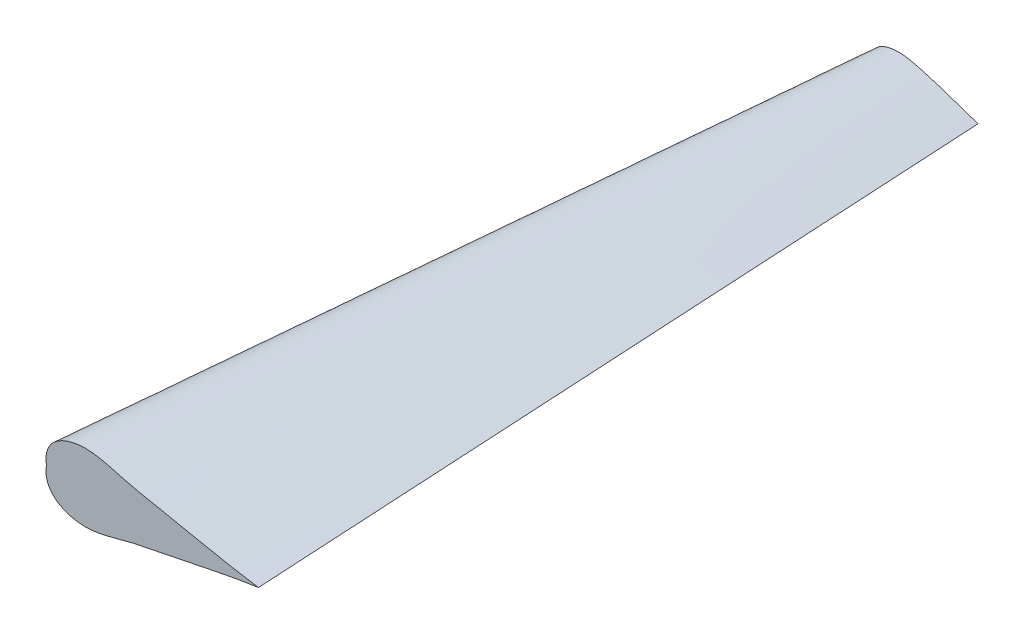
ISO-10303-21;
HEADER;
FILE_DESCRIPTION(('STEP AP214'),'2;1');
FILE_NAME('part.step','',(''),(''),'','','');
FILE_SCHEMA(('AUTOMOTIVE_DESIGN { 1 0 10303 214 1 1 1 1 }'));
ENDSEC;
DATA;
#1=APPLICATION_CONTEXT('core data for automotive mechanical design processes');
#2=APPLICATION_PROTOCOL_DEFINITION('international standard','automotive_design',2000,#1);
#3=PRODUCT_CONTEXT('',#1,'mechanical');
#4=PRODUCT('Part','Part','',(#3));
#5=PRODUCT_RELATED_PRODUCT_CATEGORY('part','',(#4));
#6=PRODUCT_DEFINITION_FORMATION('','',#4);
#7=PRODUCT_DEFINITION_CONTEXT('part definition',#1,'design');
#8=PRODUCT_DEFINITION('design','',#6,#7);
#9=PRODUCT_DEFINITION_SHAPE('','',#8);
#10=(LENGTH_UNIT() NAMED_UNIT(*) SI_UNIT(.MILLI.,.METRE.));
#11=(NAMED_UNIT(*) PLANE_ANGLE_UNIT() SI_UNIT($,.RADIAN.));
#12=(NAMED_UNIT(*) SI_UNIT($,.STERADIAN.) SOLID_ANGLE_UNIT());
#13=UNCERTAINTY_MEASURE_WITH_UNIT(LENGTH_MEASURE(1.E-05),#10,'distance_accuracy_value','');
#14=(GEOMETRIC_REPRESENTATION_CONTEXT(3) GLOBAL_UNCERTAINTY_ASSIGNED_CONTEXT((#13)) GLOBAL_UNIT_ASSIGNED_CONTEXT((#10,
#11,#12)) REPRESENTATION_CONTEXT('',''));
#15=CARTESIAN_POINT('',(0.,0.,0.));
#16=DIRECTION('',(0.,0.,1.));
#17=DIRECTION('',(1.,0.,0.));
#18=AXIS2_PLACEMENT_3D('',#15,#16,#17);
#19=CARTESIAN_POINT('',(137.136776449172,-31.2486545565491,1000.));
#20=DIRECTION('',(0.,0.,-1.));
#21=DIRECTION('',(-1.,0.,0.));
#22=AXIS2_PLACEMENT_3D('',#19,#20,#21);
#23=PLANE('',#22);
#24=CARTESIAN_POINT('',(0.,0.,1000.));
#25=CARTESIAN_POINT('',(-5.37469118703305,-30.8983506499028,1000.));
#26=CARTESIAN_POINT('',(46.7334176974178,-58.7828282851548,1000.));
#27=CARTESIAN_POINT('',(105.349466996373,-37.1004353119499,1000.));
#28=CARTESIAN_POINT('',(189.501798099044,-21.4886832675327,1000.));
#29=CARTESIAN_POINT('',(251.048679669683,-7.10279139100405,1000.));
#30=CARTESIAN_POINT('',(300.,0.,1000.));
#31=B_SPLINE_CURVE_WITH_KNOTS('',3,(#24,#25,#26,#27,#28,#29,#30),.UNSPECIFIED.,.F.,.F.,(4,1,1,1,
4),(0.,0.224641108120641,0.429840548832411,0.552694137417254,1.),.UNSPECIFIED.);
#32=CARTESIAN_POINT('',(0.,0.,1000.));
#33=VERTEX_POINT('',#32);
#34=CARTESIAN_POINT('',(300.,0.,1000.));
#35=VERTEX_POINT('',#34);
#36=EDGE_CURVE('E84',#33,#35,#31,.T.);
#37=ORIENTED_EDGE('',*,*,#36,.T.);
#38=CARTESIAN_POINT('',(300.,0.,1000.));
#39=CARTESIAN_POINT('',(251.048679669683,7.10279139100405,1000.));
#40=CARTESIAN_POINT('',(189.501798099044,21.4886832675327,1000.));
#41=CARTESIAN_POINT('',(105.349466996373,37.1004353119499,1000.));
#42=CARTESIAN_POINT('',(46.7334176974178,58.7828282851548,1000.));
#43=CARTESIAN_POINT('',(-5.37469118703305,30.8983506499028,1000.));
#44=CARTESIAN_POINT('',(0.,0.,1000.));
#45=B_SPLINE_CURVE_WITH_KNOTS('',3,(#38,#39,#40,#41,#42,#43,#44),.UNSPECIFIED.,.F.,.F.,(4,1,1,1,
4),(0.,0.447305862582746,0.570159451167589,0.775358891879359,1.),.UNSPECIFIED.);
#46=EDGE_CURVE('E14',#35,#33,#45,.T.);
#47=ORIENTED_EDGE('',*,*,#46,.T.);
#48=EDGE_LOOP('',(#37,#47));
#49=FACE_BOUND('',#48,.T.);
#50=ADVANCED_FACE('F71',(#49),#23,.F.);
#51=CARTESIAN_POINT('',(236.194120911862,50.6941308539003,0.));
#52=DIRECTION('',(0.,0.,-1.));
#53=DIRECTION('',(-1.,0.,0.));
#54=AXIS2_PLACEMENT_3D('',#51,#52,#53);
#55=PLANE('',#54);
#56=CARTESIAN_POINT('',(168.18857931216,77.3843621567377,0.));
#57=CARTESIAN_POINT('',(164.65724359174,55.3009599443541,0.));
#58=CARTESIAN_POINT('',(197.150828079061,41.1034128919331,0.));
#59=CARTESIAN_POINT('',(252.932096047086,54.2409456326803,0.));
#60=CARTESIAN_POINT('',(291.050772216917,68.0305693868342,0.));
#61=CARTESIAN_POINT('',(318.18857931216,77.3843621567377,0.));
#62=B_SPLINE_CURVE_WITH_KNOTS('',3,(#56,#57,#58,#59,#60,#61),.UNSPECIFIED.,.F.,.F.,(4,1,1,4),
(0.,0.300097882384008,0.498607647608849,1.),.UNSPECIFIED.);
#63=CARTESIAN_POINT('',(168.18857931216,77.3843621567377,0.));
#64=VERTEX_POINT('',#63);
#65=CARTESIAN_POINT('',(318.18857931216,77.3843621567377,0.));
#66=VERTEX_POINT('',#65);
#67=EDGE_CURVE('E106',#64,#66,#62,.T.);
#68=ORIENTED_EDGE('',*,*,#67,.F.);
#69=CARTESIAN_POINT('',(318.18857931216,77.3843621567377,0.));
#70=CARTESIAN_POINT('',(291.050772216917,86.7381549266412,0.));
#71=CARTESIAN_POINT('',(252.932096047087,100.527778680795,0.));
#72=CARTESIAN_POINT('',(197.150828079061,113.665311421542,0.));
#73=CARTESIAN_POINT('',(164.65724359174,99.4677643691214,0.));
#74=CARTESIAN_POINT('',(168.18857931216,77.3843621567377,0.));
#75=B_SPLINE_CURVE_WITH_KNOTS('',3,(#69,#70,#71,#72,#73,#74),.UNSPECIFIED.,.F.,.F.,(4,1,1,4),
(0.,0.501392352391151,0.699902117615992,1.),.UNSPECIFIED.);
#76=EDGE_CURVE('E115',#66,#64,#75,.T.);
#77=ORIENTED_EDGE('',*,*,#76,.F.);
#78=EDGE_LOOP('',(#68,#77));
#79=FACE_BOUND('',#78,.T.);
#80=ADVANCED_FACE('F123',(#79),#55,.T.);
#81=CARTESIAN_POINT('',(168.18857931216,77.3843621567377,0.));
#82=CARTESIAN_POINT('',(0.,0.,1000.));
#83=CARTESIAN_POINT('',(165.545164560016,60.8536225705259,0.));
#84=CARTESIAN_POINT('',(-5.37469118703305,-30.8983506499028,1000.));
#85=CARTESIAN_POINT('',(179.29680008681,48.9044421256928,0.));
#86=CARTESIAN_POINT('',(31.0051551856178,-50.3662038165103,1000.));
#87=CARTESIAN_POINT('',(205.490976055416,44.7235186845403,0.));
#88=CARTESIAN_POINT('',(78.5603380091365,-47.0098786991808,1000.));
#89=CARTESIAN_POINT('',(221.127878917005,46.7504571755196,0.));
#90=CARTESIAN_POINT('',(107.772065756632,-37.4653952798988,1000.));
#91=CARTESIAN_POINT('',(235.156284959351,50.3763363117218,0.));
#92=CARTESIAN_POINT('',(135.083985015742,-31.5841541062364,1000.));
#93=CARTESIAN_POINT('',(266.689212370897,59.2176519905368,0.));
#94=CARTESIAN_POINT('',(196.924985552453,-19.7535966253056,1000.));
#95=CARTESIAN_POINT('',(293.978197655058,69.0395872047299,0.));
#96=CARTESIAN_POINT('',(251.048679669683,-7.10279139100405,1000.));
#97=CARTESIAN_POINT('',(318.18857931216,77.3843621567377,0.));
#98=CARTESIAN_POINT('',(300.,0.,1000.));
#99=B_SPLINE_SURFACE_WITH_KNOTS('',3,1,((#81,#82),(#83,#84),(#85,#86),(#87,#88),(#89,#90),(#91,
#92),(#93,#94),(#95,#96),(#97,#98)),.UNSPECIFIED.,.F.,.F.,.F.,(4,1,1,1,1,1,4),(2,2),(0.,
0.224641108120641,0.300097882384008,0.429840548832411,0.498607647608849,0.552694137417254,1.),
(0.,1.),.UNSPECIFIED.);
#100=DIRECTION('',(-0.0181313819424192,-0.0771410126406209,0.996855314053969));
#101=VECTOR('',#100,1.);
#102=CARTESIAN_POINT('',(309.09428965608,38.6921810783689,500.));
#103=LINE('',#102,#101);
#104=EDGE_CURVE('E95',#66,#35,#103,.T.);
#105=DIRECTION('',(0.165378227758755,0.0760913060926108,-0.983290473319301));
#106=VECTOR('',#105,1.);
#107=CARTESIAN_POINT('',(84.0942896560802,38.6921810783689,500.));
#108=LINE('',#107,#106);
#109=EDGE_CURVE('E101',#33,#64,#108,.T.);
#110=ORIENTED_EDGE('',*,*,#67,.T.);
#111=ORIENTED_EDGE('',*,*,#104,.T.);
#112=ORIENTED_EDGE('',*,*,#36,.F.);
#113=ORIENTED_EDGE('',*,*,#109,.T.);
#114=EDGE_LOOP('',(#110,#111,#112,#113));
#115=FACE_BOUND('',#114,.T.);
#116=ADVANCED_FACE('F108',(#115),#99,.T.);
#117=CARTESIAN_POINT('',(318.18857931216,77.3843621567377,0.));
#118=CARTESIAN_POINT('',(300.,0.,1000.));
#119=CARTESIAN_POINT('',(293.978197655058,85.7291371087454,0.));
#120=CARTESIAN_POINT('',(251.048679669683,7.10279139100405,1000.));
#121=CARTESIAN_POINT('',(266.689212370897,95.5510723229386,0.));
#122=CARTESIAN_POINT('',(196.924985552453,19.7535966253056,1000.));
#123=CARTESIAN_POINT('',(235.156284959351,104.392388001754,0.));
#124=CARTESIAN_POINT('',(135.083985015742,31.5841541062364,1000.));
#125=CARTESIAN_POINT('',(221.127878917005,108.018267137956,0.));
#126=CARTESIAN_POINT('',(107.772065756632,37.4653952798988,1000.));
#127=CARTESIAN_POINT('',(205.490976055416,110.045205628935,0.));
#128=CARTESIAN_POINT('',(78.5603380091365,47.0098786991808,1000.));
#129=CARTESIAN_POINT('',(179.29680008681,105.864282187783,0.));
#130=CARTESIAN_POINT('',(31.0051551856178,50.3662038165103,1000.));
#131=CARTESIAN_POINT('',(165.545164560016,93.9151017429496,0.));
#132=CARTESIAN_POINT('',(-5.37469118703305,30.8983506499028,1000.));
#133=CARTESIAN_POINT('',(168.18857931216,77.3843621567377,0.));
#134=CARTESIAN_POINT('',(0.,0.,1000.));
#135=B_SPLINE_SURFACE_WITH_KNOTS('',3,1,((#117,#118),(#119,#120),(#121,#122),(#123,#124),(#125,
#126),(#127,#128),(#129,#130),(#131,#132),(#133,#134)),.UNSPECIFIED.,.F.,.F.,.F.,(4,1,1,1,1,1,
4),(2,2),(0.,0.447305862582746,0.501392352391151,0.570159451167589,0.699902117615992,
0.775358891879359,1.),(0.,1.),.UNSPECIFIED.);
#136=ORIENTED_EDGE('',*,*,#76,.T.);
#137=ORIENTED_EDGE('',*,*,#109,.F.);
#138=ORIENTED_EDGE('',*,*,#46,.F.);
#139=ORIENTED_EDGE('',*,*,#104,.F.);
#140=EDGE_LOOP('',(#136,#137,#138,#139));
#141=FACE_BOUND('',#140,.T.);
#142=ADVANCED_FACE('F113',(#141),#135,.T.);
#143=CLOSED_SHELL('',(#50,#80,#116,#142));
#144=MANIFOLD_SOLID_BREP('B2',#143);
#145=ADVANCED_BREP_SHAPE_REPRESENTATION('',(#18,#144),#14);
#146=SHAPE_DEFINITION_REPRESENTATION(#9,#145);
ENDSEC;
END-ISO-10303-21;
